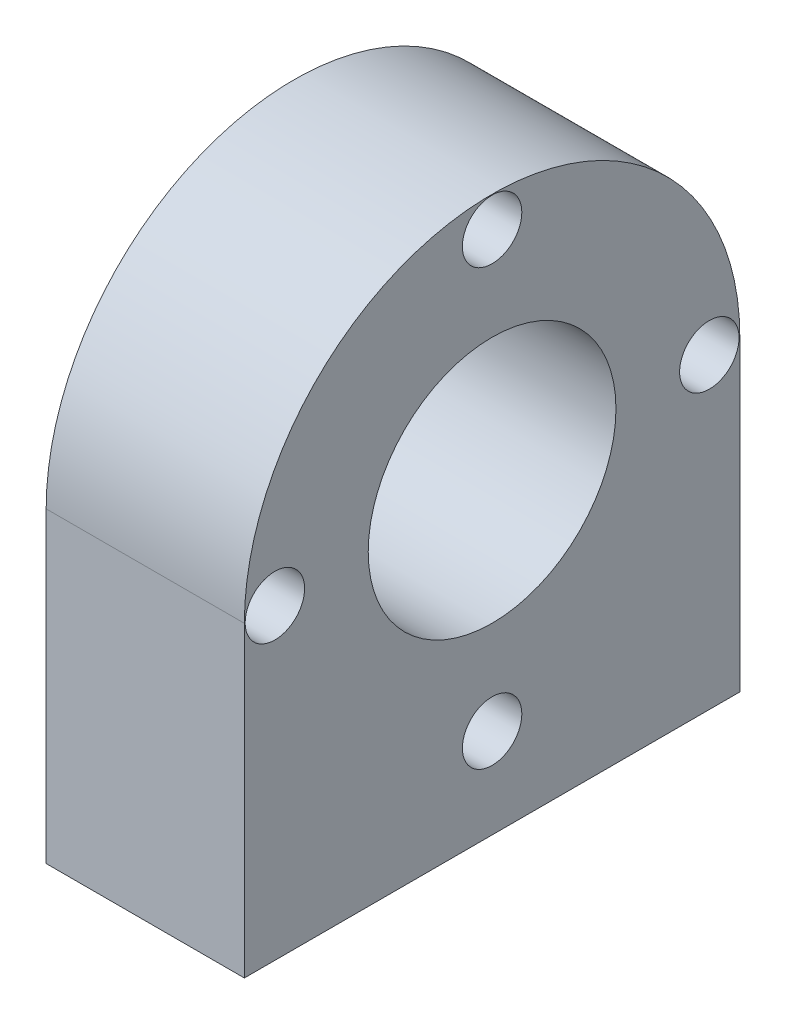
ISO-10303-21;
HEADER;
FILE_DESCRIPTION(('STEP AP214'),'2;1');
FILE_NAME('part.step','',(''),(''),'','','');
FILE_SCHEMA(('AUTOMOTIVE_DESIGN { 1 0 10303 214 1 1 1 1 }'));
ENDSEC;
DATA;
#1=APPLICATION_CONTEXT('core data for automotive mechanical design processes');
#2=APPLICATION_PROTOCOL_DEFINITION('international standard','automotive_design',2000,#1);
#3=PRODUCT_CONTEXT('',#1,'mechanical');
#4=PRODUCT('Part','Part','',(#3));
#5=PRODUCT_RELATED_PRODUCT_CATEGORY('part','',(#4));
#6=PRODUCT_DEFINITION_FORMATION('','',#4);
#7=PRODUCT_DEFINITION_CONTEXT('part definition',#1,'design');
#8=PRODUCT_DEFINITION('design','',#6,#7);
#9=PRODUCT_DEFINITION_SHAPE('','',#8);
#10=(LENGTH_UNIT() NAMED_UNIT(*) SI_UNIT(.MILLI.,.METRE.));
#11=(NAMED_UNIT(*) PLANE_ANGLE_UNIT() SI_UNIT($,.RADIAN.));
#12=(NAMED_UNIT(*) SI_UNIT($,.STERADIAN.) SOLID_ANGLE_UNIT());
#13=UNCERTAINTY_MEASURE_WITH_UNIT(LENGTH_MEASURE(1.E-05),#10,'distance_accuracy_value','');
#14=(GEOMETRIC_REPRESENTATION_CONTEXT(3) GLOBAL_UNCERTAINTY_ASSIGNED_CONTEXT((#13)) GLOBAL_UNIT_ASSIGNED_CONTEXT((#10,
#11,#12)) REPRESENTATION_CONTEXT('',''));
#15=CARTESIAN_POINT('',(0.,0.,0.));
#16=DIRECTION('',(0.,0.,1.));
#17=DIRECTION('',(1.,0.,0.));
#18=AXIS2_PLACEMENT_3D('',#15,#16,#17);
#19=CARTESIAN_POINT('',(10.,9.07968978321703,-2.28983498828939E-13));
#20=DIRECTION('',(-1.,0.,0.));
#21=DIRECTION('',(0.,0.,1.));
#22=AXIS2_PLACEMENT_3D('',#19,#20,#21);
#23=CYLINDRICAL_SURFACE('',#22,1.5);
#24=CARTESIAN_POINT('',(-10.,9.07968978321703,-2.28983498828939E-13));
#25=DIRECTION('',(-1.,0.,0.));
#26=DIRECTION('',(0.,0.,1.));
#27=AXIS2_PLACEMENT_3D('',#24,#25,#26);
#28=CIRCLE('',#27,1.5);
#29=CARTESIAN_POINT('',(-10.,9.07968978321703,1.49999999999977));
#30=VERTEX_POINT('',#29);
#31=EDGE_CURVE('E153',#30,#30,#28,.T.);
#32=CARTESIAN_POINT('',(-2.,9.07968978321703,-2.28983498828939E-13));
#33=DIRECTION('',(1.,0.,0.));
#34=DIRECTION('',(0.,0.,-1.));
#35=AXIS2_PLACEMENT_3D('',#32,#33,#34);
#36=CIRCLE('',#35,1.5);
#37=CARTESIAN_POINT('',(-2.,9.07968978321703,1.49999999999977));
#38=VERTEX_POINT('',#37);
#39=EDGE_CURVE('E140',#38,#38,#36,.F.);
#40=CARTESIAN_POINT('',(-10.,9.07968978321703,1.49999999999977));
#41=CARTESIAN_POINT('',(-9.91666666666667,9.07968978321703,1.49999999999977));
#42=CARTESIAN_POINT('',(-9.83333333333333,9.07968978321703,1.49999999999977));
#43=CARTESIAN_POINT('',(-9.66666666666667,9.07968978321703,1.49999999999977));
#44=CARTESIAN_POINT('',(-9.58333333333333,9.07968978321703,1.49999999999977));
#45=CARTESIAN_POINT('',(-9.41666666666667,9.07968978321703,1.49999999999977));
#46=CARTESIAN_POINT('',(-9.33333333333333,9.07968978321703,1.49999999999977));
#47=CARTESIAN_POINT('',(-9.16666666666667,9.07968978321703,1.49999999999977));
#48=CARTESIAN_POINT('',(-9.08333333333333,9.07968978321703,1.49999999999977));
#49=CARTESIAN_POINT('',(-8.91666666666667,9.07968978321703,1.49999999999977));
#50=CARTESIAN_POINT('',(-8.83333333333333,9.07968978321703,1.49999999999977));
#51=CARTESIAN_POINT('',(-8.66666666666667,9.07968978321703,1.49999999999977));
#52=CARTESIAN_POINT('',(-8.58333333333333,9.07968978321703,1.49999999999977));
#53=CARTESIAN_POINT('',(-8.41666666666667,9.07968978321703,1.49999999999977));
#54=CARTESIAN_POINT('',(-8.33333333333333,9.07968978321703,1.49999999999977));
#55=CARTESIAN_POINT('',(-8.16666666666667,9.07968978321703,1.49999999999977));
#56=CARTESIAN_POINT('',(-8.08333333333333,9.07968978321703,1.49999999999977));
#57=CARTESIAN_POINT('',(-7.91666666666667,9.07968978321703,1.49999999999977));
#58=CARTESIAN_POINT('',(-7.83333333333333,9.07968978321703,1.49999999999977));
#59=CARTESIAN_POINT('',(-7.66666666666667,9.07968978321703,1.49999999999977));
#60=CARTESIAN_POINT('',(-7.58333333333333,9.07968978321703,1.49999999999977));
#61=CARTESIAN_POINT('',(-7.41666666666667,9.07968978321703,1.49999999999977));
#62=CARTESIAN_POINT('',(-7.33333333333334,9.07968978321703,1.49999999999977));
#63=CARTESIAN_POINT('',(-7.16666666666667,9.07968978321703,1.49999999999977));
#64=CARTESIAN_POINT('',(-7.08333333333334,9.07968978321703,1.49999999999977));
#65=CARTESIAN_POINT('',(-6.91666666666667,9.07968978321703,1.49999999999977));
#66=CARTESIAN_POINT('',(-6.83333333333334,9.07968978321703,1.49999999999977));
#67=CARTESIAN_POINT('',(-6.66666666666667,9.07968978321703,1.49999999999977));
#68=CARTESIAN_POINT('',(-6.58333333333334,9.07968978321703,1.49999999999977));
#69=CARTESIAN_POINT('',(-6.41666666666667,9.07968978321703,1.49999999999977));
#70=CARTESIAN_POINT('',(-6.33333333333334,9.07968978321703,1.49999999999977));
#71=CARTESIAN_POINT('',(-6.16666666666667,9.07968978321703,1.49999999999977));
#72=CARTESIAN_POINT('',(-6.08333333333334,9.07968978321703,1.49999999999977));
#73=CARTESIAN_POINT('',(-5.91666666666667,9.07968978321703,1.49999999999977));
#74=CARTESIAN_POINT('',(-5.83333333333334,9.07968978321703,1.49999999999977));
#75=CARTESIAN_POINT('',(-5.66666666666667,9.07968978321703,1.49999999999977));
#76=CARTESIAN_POINT('',(-5.58333333333334,9.07968978321703,1.49999999999977));
#77=CARTESIAN_POINT('',(-5.41666666666667,9.07968978321703,1.49999999999977));
#78=CARTESIAN_POINT('',(-5.33333333333334,9.07968978321703,1.49999999999977));
#79=CARTESIAN_POINT('',(-5.16666666666667,9.07968978321703,1.49999999999977));
#80=CARTESIAN_POINT('',(-5.08333333333334,9.07968978321703,1.49999999999977));
#81=CARTESIAN_POINT('',(-4.91666666666667,9.07968978321703,1.49999999999977));
#82=CARTESIAN_POINT('',(-4.83333333333334,9.07968978321703,1.49999999999977));
#83=CARTESIAN_POINT('',(-4.66666666666667,9.07968978321703,1.49999999999977));
#84=CARTESIAN_POINT('',(-4.58333333333334,9.07968978321703,1.49999999999977));
#85=CARTESIAN_POINT('',(-4.41666666666667,9.07968978321703,1.49999999999977));
#86=CARTESIAN_POINT('',(-4.33333333333334,9.07968978321703,1.49999999999977));
#87=CARTESIAN_POINT('',(-4.16666666666667,9.07968978321703,1.49999999999977));
#88=CARTESIAN_POINT('',(-4.08333333333334,9.07968978321703,1.49999999999977));
#89=CARTESIAN_POINT('',(-3.91666666666667,9.07968978321703,1.49999999999977));
#90=CARTESIAN_POINT('',(-3.83333333333334,9.07968978321703,1.49999999999977));
#91=CARTESIAN_POINT('',(-3.66666666666667,9.07968978321703,1.49999999999977));
#92=CARTESIAN_POINT('',(-3.58333333333334,9.07968978321703,1.49999999999977));
#93=CARTESIAN_POINT('',(-3.41666666666667,9.07968978321703,1.49999999999977));
#94=CARTESIAN_POINT('',(-3.33333333333334,9.07968978321703,1.49999999999977));
#95=CARTESIAN_POINT('',(-3.16666666666667,9.07968978321703,1.49999999999977));
#96=CARTESIAN_POINT('',(-3.08333333333334,9.07968978321703,1.49999999999977));
#97=CARTESIAN_POINT('',(-2.91666666666667,9.07968978321703,1.49999999999977));
#98=CARTESIAN_POINT('',(-2.83333333333334,9.07968978321703,1.49999999999977));
#99=CARTESIAN_POINT('',(-2.66666666666667,9.07968978321703,1.49999999999977));
#100=CARTESIAN_POINT('',(-2.58333333333334,9.07968978321703,1.49999999999977));
#101=CARTESIAN_POINT('',(-2.41666666666667,9.07968978321703,1.49999999999977));
#102=CARTESIAN_POINT('',(-2.33333333333334,9.07968978321703,1.49999999999977));
#103=CARTESIAN_POINT('',(-2.16666666666667,9.07968978321703,1.49999999999977));
#104=CARTESIAN_POINT('',(-2.08333333333334,9.07968978321703,1.49999999999977));
#105=CARTESIAN_POINT('',(-2.,9.07968978321703,1.49999999999977));
#106=B_SPLINE_CURVE_WITH_KNOTS('',3,(#40,#41,#42,#43,#44,#45,#46,#47,#48,#49,#50,#51,#52,#53,
#54,#55,#56,#57,#58,#59,#60,#61,#62,#63,#64,#65,#66,#67,#68,#69,#70,#71,#72,#73,#74,#75,#76,#77,
#78,#79,#80,#81,#82,#83,#84,#85,#86,#87,#88,#89,#90,#91,#92,#93,#94,#95,#96,#97,#98,#99,#100,
#101,#102,#103,#104,#105),.UNSPECIFIED.,.F.,.F.,(4,2,2,2,2,2,2,2,2,2,2,2,2,2,2,2,2,2,2,2,2,2,2,
2,2,2,2,2,2,2,2,2,4),(0.,0.25,0.5,0.750000000000001,1.,1.25,1.5,1.75,2.,2.25,2.5,2.75,3.,3.25,
3.5,3.75,4.,4.25,4.5,4.75,5.,5.25,5.5,5.75,6.,6.25,6.5,6.75,7.,7.25,7.5,7.75,8.),.UNSPECIFIED.);
#107=EDGE_CURVE('BSEAM65',#30,#38,#106,.T.);
#108=ORIENTED_EDGE('',*,*,#31,.T.);
#109=ORIENTED_EDGE('',*,*,#39,.F.);
#110=ORIENTED_EDGE('',*,*,#107,.T.);
#111=ORIENTED_EDGE('',*,*,#107,.F.);
#112=EDGE_LOOP('',(#108,#110,#109,#111));
#113=FACE_BOUND('',#112,.T.);
#114=ADVANCED_FACE('F65',(#113),#23,.F.);
#115=CARTESIAN_POINT('',(10.,30.9999999999998,21.920310216783));
#116=DIRECTION('',(-1.,0.,0.));
#117=DIRECTION('',(0.,0.,1.));
#118=AXIS2_PLACEMENT_3D('',#115,#116,#117);
#119=CYLINDRICAL_SURFACE('',#118,1.5);
#120=CARTESIAN_POINT('',(-10.,30.9999999999998,21.920310216783));
#121=DIRECTION('',(-1.,0.,0.));
#122=DIRECTION('',(0.,0.,1.));
#123=AXIS2_PLACEMENT_3D('',#120,#121,#122);
#124=CIRCLE('',#123,1.5);
#125=CARTESIAN_POINT('',(-10.,30.9999999999998,23.420310216783));
#126=VERTEX_POINT('',#125);
#127=EDGE_CURVE('E157',#126,#126,#124,.T.);
#128=CARTESIAN_POINT('',(-2.,30.9999999999998,21.920310216783));
#129=DIRECTION('',(1.,0.,0.));
#130=DIRECTION('',(0.,0.,-1.));
#131=AXIS2_PLACEMENT_3D('',#128,#129,#130);
#132=CIRCLE('',#131,1.5);
#133=CARTESIAN_POINT('',(-2.,30.9999999999998,23.420310216783));
#134=VERTEX_POINT('',#133);
#135=EDGE_CURVE('E137',#134,#134,#132,.F.);
#136=CARTESIAN_POINT('',(-10.,30.9999999999998,23.420310216783));
#137=CARTESIAN_POINT('',(-9.91666666666667,30.9999999999998,23.420310216783));
#138=CARTESIAN_POINT('',(-9.83333333333333,30.9999999999998,23.420310216783));
#139=CARTESIAN_POINT('',(-9.66666666666667,30.9999999999998,23.420310216783));
#140=CARTESIAN_POINT('',(-9.58333333333333,30.9999999999998,23.420310216783));
#141=CARTESIAN_POINT('',(-9.41666666666667,30.9999999999998,23.420310216783));
#142=CARTESIAN_POINT('',(-9.33333333333333,30.9999999999998,23.420310216783));
#143=CARTESIAN_POINT('',(-9.16666666666667,30.9999999999998,23.420310216783));
#144=CARTESIAN_POINT('',(-9.08333333333333,30.9999999999998,23.420310216783));
#145=CARTESIAN_POINT('',(-8.91666666666667,30.9999999999998,23.420310216783));
#146=CARTESIAN_POINT('',(-8.83333333333333,30.9999999999998,23.420310216783));
#147=CARTESIAN_POINT('',(-8.66666666666667,30.9999999999998,23.420310216783));
#148=CARTESIAN_POINT('',(-8.58333333333333,30.9999999999998,23.420310216783));
#149=CARTESIAN_POINT('',(-8.41666666666667,30.9999999999998,23.420310216783));
#150=CARTESIAN_POINT('',(-8.33333333333333,30.9999999999998,23.420310216783));
#151=CARTESIAN_POINT('',(-8.16666666666667,30.9999999999998,23.420310216783));
#152=CARTESIAN_POINT('',(-8.08333333333333,30.9999999999998,23.420310216783));
#153=CARTESIAN_POINT('',(-7.91666666666667,30.9999999999998,23.420310216783));
#154=CARTESIAN_POINT('',(-7.83333333333333,30.9999999999998,23.420310216783));
#155=CARTESIAN_POINT('',(-7.66666666666667,30.9999999999998,23.420310216783));
#156=CARTESIAN_POINT('',(-7.58333333333333,30.9999999999998,23.420310216783));
#157=CARTESIAN_POINT('',(-7.41666666666667,30.9999999999998,23.420310216783));
#158=CARTESIAN_POINT('',(-7.33333333333334,30.9999999999998,23.420310216783));
#159=CARTESIAN_POINT('',(-7.16666666666667,30.9999999999998,23.420310216783));
#160=CARTESIAN_POINT('',(-7.08333333333334,30.9999999999998,23.420310216783));
#161=CARTESIAN_POINT('',(-6.91666666666667,30.9999999999998,23.420310216783));
#162=CARTESIAN_POINT('',(-6.83333333333334,30.9999999999998,23.420310216783));
#163=CARTESIAN_POINT('',(-6.66666666666667,30.9999999999998,23.420310216783));
#164=CARTESIAN_POINT('',(-6.58333333333334,30.9999999999998,23.420310216783));
#165=CARTESIAN_POINT('',(-6.41666666666667,30.9999999999998,23.420310216783));
#166=CARTESIAN_POINT('',(-6.33333333333334,30.9999999999998,23.420310216783));
#167=CARTESIAN_POINT('',(-6.16666666666667,30.9999999999998,23.420310216783));
#168=CARTESIAN_POINT('',(-6.08333333333334,30.9999999999998,23.420310216783));
#169=CARTESIAN_POINT('',(-5.91666666666667,30.9999999999998,23.420310216783));
#170=CARTESIAN_POINT('',(-5.83333333333334,30.9999999999998,23.420310216783));
#171=CARTESIAN_POINT('',(-5.66666666666667,30.9999999999998,23.420310216783));
#172=CARTESIAN_POINT('',(-5.58333333333334,30.9999999999998,23.420310216783));
#173=CARTESIAN_POINT('',(-5.41666666666667,30.9999999999998,23.420310216783));
#174=CARTESIAN_POINT('',(-5.33333333333334,30.9999999999998,23.420310216783));
#175=CARTESIAN_POINT('',(-5.16666666666667,30.9999999999998,23.420310216783));
#176=CARTESIAN_POINT('',(-5.08333333333334,30.9999999999998,23.420310216783));
#177=CARTESIAN_POINT('',(-4.91666666666667,30.9999999999998,23.420310216783));
#178=CARTESIAN_POINT('',(-4.83333333333334,30.9999999999998,23.420310216783));
#179=CARTESIAN_POINT('',(-4.66666666666667,30.9999999999998,23.420310216783));
#180=CARTESIAN_POINT('',(-4.58333333333334,30.9999999999998,23.420310216783));
#181=CARTESIAN_POINT('',(-4.41666666666667,30.9999999999998,23.420310216783));
#182=CARTESIAN_POINT('',(-4.33333333333334,30.9999999999998,23.420310216783));
#183=CARTESIAN_POINT('',(-4.16666666666667,30.9999999999998,23.420310216783));
#184=CARTESIAN_POINT('',(-4.08333333333334,30.9999999999998,23.420310216783));
#185=CARTESIAN_POINT('',(-3.91666666666667,30.9999999999998,23.420310216783));
#186=CARTESIAN_POINT('',(-3.83333333333334,30.9999999999998,23.420310216783));
#187=CARTESIAN_POINT('',(-3.66666666666667,30.9999999999998,23.420310216783));
#188=CARTESIAN_POINT('',(-3.58333333333334,30.9999999999998,23.420310216783));
#189=CARTESIAN_POINT('',(-3.41666666666667,30.9999999999998,23.420310216783));
#190=CARTESIAN_POINT('',(-3.33333333333334,30.9999999999998,23.420310216783));
#191=CARTESIAN_POINT('',(-3.16666666666667,30.9999999999998,23.420310216783));
#192=CARTESIAN_POINT('',(-3.08333333333334,30.9999999999998,23.420310216783));
#193=CARTESIAN_POINT('',(-2.91666666666667,30.9999999999998,23.420310216783));
#194=CARTESIAN_POINT('',(-2.83333333333334,30.9999999999998,23.420310216783));
#195=CARTESIAN_POINT('',(-2.66666666666667,30.9999999999998,23.420310216783));
#196=CARTESIAN_POINT('',(-2.58333333333334,30.9999999999998,23.420310216783));
#197=CARTESIAN_POINT('',(-2.41666666666667,30.9999999999998,23.420310216783));
#198=CARTESIAN_POINT('',(-2.33333333333334,30.9999999999998,23.420310216783));
#199=CARTESIAN_POINT('',(-2.16666666666667,30.9999999999998,23.420310216783));
#200=CARTESIAN_POINT('',(-2.08333333333334,30.9999999999998,23.420310216783));
#201=CARTESIAN_POINT('',(-2.,30.9999999999998,23.420310216783));
#202=B_SPLINE_CURVE_WITH_KNOTS('',3,(#136,#137,#138,#139,#140,#141,#142,#143,#144,#145,#146,
#147,#148,#149,#150,#151,#152,#153,#154,#155,#156,#157,#158,#159,#160,#161,#162,#163,#164,#165,
#166,#167,#168,#169,#170,#171,#172,#173,#174,#175,#176,#177,#178,#179,#180,#181,#182,#183,#184,
#185,#186,#187,#188,#189,#190,#191,#192,#193,#194,#195,#196,#197,#198,#199,#200,#201),
.UNSPECIFIED.,.F.,.F.,(4,2,2,2,2,2,2,2,2,2,2,2,2,2,2,2,2,2,2,2,2,2,2,2,2,2,2,2,2,2,2,2,4),(0.,
0.25,0.5,0.750000000000001,1.,1.25,1.5,1.75,2.,2.25,2.5,2.75,3.,3.25,3.5,3.75,4.,4.25,4.5,4.75,
5.,5.25,5.5,5.75,6.,6.25,6.5,6.75,7.,7.25,7.5,7.75,8.),.UNSPECIFIED.);
#203=EDGE_CURVE('BSEAM221',#126,#134,#202,.T.);
#204=ORIENTED_EDGE('',*,*,#127,.T.);
#205=ORIENTED_EDGE('',*,*,#135,.F.);
#206=ORIENTED_EDGE('',*,*,#203,.T.);
#207=ORIENTED_EDGE('',*,*,#203,.F.);
#208=EDGE_LOOP('',(#204,#206,#205,#207));
#209=FACE_BOUND('',#208,.T.);
#210=ADVANCED_FACE('F221',(#209),#119,.F.);
#211=CARTESIAN_POINT('',(10.,52.920310216783,0.));
#212=DIRECTION('',(-1.,0.,0.));
#213=DIRECTION('',(0.,0.,1.));
#214=AXIS2_PLACEMENT_3D('',#211,#212,#213);
#215=CYLINDRICAL_SURFACE('',#214,1.50000000000001);
#216=CARTESIAN_POINT('',(-10.,52.920310216783,0.));
#217=DIRECTION('',(-1.,0.,0.));
#218=DIRECTION('',(0.,0.,1.));
#219=AXIS2_PLACEMENT_3D('',#216,#217,#218);
#220=CIRCLE('',#219,1.50000000000001);
#221=CARTESIAN_POINT('',(-10.,52.920310216783,1.50000000000009));
#222=VERTEX_POINT('',#221);
#223=EDGE_CURVE('E162',#222,#222,#220,.T.);
#224=CARTESIAN_POINT('',(-2.,52.920310216783,0.));
#225=DIRECTION('',(1.,0.,0.));
#226=DIRECTION('',(0.,0.,-1.));
#227=AXIS2_PLACEMENT_3D('',#224,#225,#226);
#228=CIRCLE('',#227,1.50000000000001);
#229=CARTESIAN_POINT('',(-2.,52.920310216783,1.50000000000009));
#230=VERTEX_POINT('',#229);
#231=EDGE_CURVE('E133',#230,#230,#228,.F.);
#232=CARTESIAN_POINT('',(-10.,52.920310216783,1.50000000000009));
#233=CARTESIAN_POINT('',(-9.91666666666667,52.920310216783,1.50000000000009));
#234=CARTESIAN_POINT('',(-9.83333333333333,52.920310216783,1.50000000000009));
#235=CARTESIAN_POINT('',(-9.66666666666667,52.920310216783,1.50000000000009));
#236=CARTESIAN_POINT('',(-9.58333333333333,52.920310216783,1.50000000000009));
#237=CARTESIAN_POINT('',(-9.41666666666667,52.920310216783,1.50000000000009));
#238=CARTESIAN_POINT('',(-9.33333333333333,52.920310216783,1.50000000000009));
#239=CARTESIAN_POINT('',(-9.16666666666667,52.920310216783,1.50000000000009));
#240=CARTESIAN_POINT('',(-9.08333333333333,52.920310216783,1.50000000000009));
#241=CARTESIAN_POINT('',(-8.91666666666667,52.920310216783,1.50000000000009));
#242=CARTESIAN_POINT('',(-8.83333333333333,52.920310216783,1.50000000000009));
#243=CARTESIAN_POINT('',(-8.66666666666667,52.920310216783,1.50000000000009));
#244=CARTESIAN_POINT('',(-8.58333333333333,52.920310216783,1.50000000000009));
#245=CARTESIAN_POINT('',(-8.41666666666667,52.920310216783,1.50000000000009));
#246=CARTESIAN_POINT('',(-8.33333333333333,52.920310216783,1.50000000000009));
#247=CARTESIAN_POINT('',(-8.16666666666667,52.920310216783,1.50000000000009));
#248=CARTESIAN_POINT('',(-8.08333333333333,52.920310216783,1.50000000000009));
#249=CARTESIAN_POINT('',(-7.91666666666667,52.920310216783,1.50000000000009));
#250=CARTESIAN_POINT('',(-7.83333333333333,52.920310216783,1.50000000000009));
#251=CARTESIAN_POINT('',(-7.66666666666667,52.920310216783,1.50000000000009));
#252=CARTESIAN_POINT('',(-7.58333333333333,52.920310216783,1.50000000000009));
#253=CARTESIAN_POINT('',(-7.41666666666667,52.920310216783,1.50000000000009));
#254=CARTESIAN_POINT('',(-7.33333333333334,52.920310216783,1.50000000000009));
#255=CARTESIAN_POINT('',(-7.16666666666667,52.920310216783,1.50000000000009));
#256=CARTESIAN_POINT('',(-7.08333333333334,52.920310216783,1.50000000000009));
#257=CARTESIAN_POINT('',(-6.91666666666667,52.920310216783,1.50000000000009));
#258=CARTESIAN_POINT('',(-6.83333333333334,52.920310216783,1.50000000000009));
#259=CARTESIAN_POINT('',(-6.66666666666667,52.920310216783,1.50000000000009));
#260=CARTESIAN_POINT('',(-6.58333333333334,52.920310216783,1.50000000000009));
#261=CARTESIAN_POINT('',(-6.41666666666667,52.920310216783,1.50000000000009));
#262=CARTESIAN_POINT('',(-6.33333333333334,52.920310216783,1.50000000000009));
#263=CARTESIAN_POINT('',(-6.16666666666667,52.920310216783,1.50000000000009));
#264=CARTESIAN_POINT('',(-6.08333333333334,52.920310216783,1.50000000000009));
#265=CARTESIAN_POINT('',(-5.91666666666667,52.920310216783,1.50000000000009));
#266=CARTESIAN_POINT('',(-5.83333333333334,52.920310216783,1.50000000000009));
#267=CARTESIAN_POINT('',(-5.66666666666667,52.920310216783,1.50000000000009));
#268=CARTESIAN_POINT('',(-5.58333333333334,52.920310216783,1.50000000000009));
#269=CARTESIAN_POINT('',(-5.41666666666667,52.920310216783,1.50000000000009));
#270=CARTESIAN_POINT('',(-5.33333333333334,52.920310216783,1.50000000000009));
#271=CARTESIAN_POINT('',(-5.16666666666667,52.920310216783,1.50000000000009));
#272=CARTESIAN_POINT('',(-5.08333333333334,52.920310216783,1.50000000000009));
#273=CARTESIAN_POINT('',(-4.91666666666667,52.920310216783,1.50000000000009));
#274=CARTESIAN_POINT('',(-4.83333333333334,52.920310216783,1.50000000000009));
#275=CARTESIAN_POINT('',(-4.66666666666667,52.920310216783,1.50000000000009));
#276=CARTESIAN_POINT('',(-4.58333333333334,52.920310216783,1.50000000000009));
#277=CARTESIAN_POINT('',(-4.41666666666667,52.920310216783,1.50000000000009));
#278=CARTESIAN_POINT('',(-4.33333333333334,52.920310216783,1.50000000000009));
#279=CARTESIAN_POINT('',(-4.16666666666667,52.920310216783,1.50000000000009));
#280=CARTESIAN_POINT('',(-4.08333333333334,52.920310216783,1.50000000000009));
#281=CARTESIAN_POINT('',(-3.91666666666667,52.920310216783,1.50000000000009));
#282=CARTESIAN_POINT('',(-3.83333333333334,52.920310216783,1.50000000000009));
#283=CARTESIAN_POINT('',(-3.66666666666667,52.920310216783,1.50000000000009));
#284=CARTESIAN_POINT('',(-3.58333333333334,52.920310216783,1.50000000000009));
#285=CARTESIAN_POINT('',(-3.41666666666667,52.920310216783,1.50000000000009));
#286=CARTESIAN_POINT('',(-3.33333333333334,52.920310216783,1.50000000000009));
#287=CARTESIAN_POINT('',(-3.16666666666667,52.920310216783,1.50000000000009));
#288=CARTESIAN_POINT('',(-3.08333333333334,52.920310216783,1.50000000000009));
#289=CARTESIAN_POINT('',(-2.91666666666667,52.920310216783,1.50000000000009));
#290=CARTESIAN_POINT('',(-2.83333333333334,52.920310216783,1.50000000000009));
#291=CARTESIAN_POINT('',(-2.66666666666667,52.920310216783,1.50000000000009));
#292=CARTESIAN_POINT('',(-2.58333333333334,52.920310216783,1.50000000000009));
#293=CARTESIAN_POINT('',(-2.41666666666667,52.920310216783,1.50000000000009));
#294=CARTESIAN_POINT('',(-2.33333333333334,52.920310216783,1.50000000000009));
#295=CARTESIAN_POINT('',(-2.16666666666667,52.920310216783,1.50000000000009));
#296=CARTESIAN_POINT('',(-2.08333333333334,52.920310216783,1.50000000000009));
#297=CARTESIAN_POINT('',(-2.,52.920310216783,1.50000000000009));
#298=B_SPLINE_CURVE_WITH_KNOTS('',3,(#232,#233,#234,#235,#236,#237,#238,#239,#240,#241,#242,
#243,#244,#245,#246,#247,#248,#249,#250,#251,#252,#253,#254,#255,#256,#257,#258,#259,#260,#261,
#262,#263,#264,#265,#266,#267,#268,#269,#270,#271,#272,#273,#274,#275,#276,#277,#278,#279,#280,
#281,#282,#283,#284,#285,#286,#287,#288,#289,#290,#291,#292,#293,#294,#295,#296,#297),
.UNSPECIFIED.,.F.,.F.,(4,2,2,2,2,2,2,2,2,2,2,2,2,2,2,2,2,2,2,2,2,2,2,2,2,2,2,2,2,2,2,2,4),(0.,
0.25,0.5,0.750000000000001,1.,1.25,1.5,1.75,2.,2.25,2.5,2.75,3.,3.25,3.5,3.75,4.,4.25,4.5,4.75,
5.,5.25,5.5,5.75,6.,6.25,6.5,6.75,7.,7.25,7.5,7.75,8.),.UNSPECIFIED.);
#299=EDGE_CURVE('BSEAM226',#222,#230,#298,.T.);
#300=ORIENTED_EDGE('',*,*,#223,.T.);
#301=ORIENTED_EDGE('',*,*,#231,.F.);
#302=ORIENTED_EDGE('',*,*,#299,.T.);
#303=ORIENTED_EDGE('',*,*,#299,.F.);
#304=EDGE_LOOP('',(#300,#302,#301,#303));
#305=FACE_BOUND('',#304,.T.);
#306=ADVANCED_FACE('F226',(#305),#215,.F.);
#307=CARTESIAN_POINT('',(10.,31.,-21.920310216783));
#308=DIRECTION('',(-1.,0.,0.));
#309=DIRECTION('',(0.,0.,1.));
#310=AXIS2_PLACEMENT_3D('',#307,#308,#309);
#311=CYLINDRICAL_SURFACE('',#310,1.5);
#312=CARTESIAN_POINT('',(-10.,31.,-21.920310216783));
#313=DIRECTION('',(-1.,0.,0.));
#314=DIRECTION('',(0.,0.,1.));
#315=AXIS2_PLACEMENT_3D('',#312,#313,#314);
#316=CIRCLE('',#315,1.5);
#317=CARTESIAN_POINT('',(-10.,31.,-20.420310216783));
#318=VERTEX_POINT('',#317);
#319=EDGE_CURVE('E191',#318,#318,#316,.T.);
#320=CARTESIAN_POINT('',(-2.,31.,-21.920310216783));
#321=DIRECTION('',(1.,0.,0.));
#322=DIRECTION('',(0.,0.,-1.));
#323=AXIS2_PLACEMENT_3D('',#320,#321,#322);
#324=CIRCLE('',#323,1.5);
#325=CARTESIAN_POINT('',(-2.,31.,-20.420310216783));
#326=VERTEX_POINT('',#325);
#327=EDGE_CURVE('E130',#326,#326,#324,.F.);
#328=CARTESIAN_POINT('',(-10.,31.,-20.420310216783));
#329=CARTESIAN_POINT('',(-9.91666666666667,31.,-20.420310216783));
#330=CARTESIAN_POINT('',(-9.83333333333333,31.,-20.420310216783));
#331=CARTESIAN_POINT('',(-9.66666666666667,31.,-20.420310216783));
#332=CARTESIAN_POINT('',(-9.58333333333333,31.,-20.420310216783));
#333=CARTESIAN_POINT('',(-9.41666666666667,31.,-20.420310216783));
#334=CARTESIAN_POINT('',(-9.33333333333333,31.,-20.420310216783));
#335=CARTESIAN_POINT('',(-9.16666666666667,31.,-20.420310216783));
#336=CARTESIAN_POINT('',(-9.08333333333333,31.,-20.420310216783));
#337=CARTESIAN_POINT('',(-8.91666666666667,31.,-20.420310216783));
#338=CARTESIAN_POINT('',(-8.83333333333333,31.,-20.420310216783));
#339=CARTESIAN_POINT('',(-8.66666666666667,31.,-20.420310216783));
#340=CARTESIAN_POINT('',(-8.58333333333333,31.,-20.420310216783));
#341=CARTESIAN_POINT('',(-8.41666666666667,31.,-20.420310216783));
#342=CARTESIAN_POINT('',(-8.33333333333333,31.,-20.420310216783));
#343=CARTESIAN_POINT('',(-8.16666666666667,31.,-20.420310216783));
#344=CARTESIAN_POINT('',(-8.08333333333333,31.,-20.420310216783));
#345=CARTESIAN_POINT('',(-7.91666666666667,31.,-20.420310216783));
#346=CARTESIAN_POINT('',(-7.83333333333333,31.,-20.420310216783));
#347=CARTESIAN_POINT('',(-7.66666666666667,31.,-20.420310216783));
#348=CARTESIAN_POINT('',(-7.58333333333333,31.,-20.420310216783));
#349=CARTESIAN_POINT('',(-7.41666666666667,31.,-20.420310216783));
#350=CARTESIAN_POINT('',(-7.33333333333334,31.,-20.420310216783));
#351=CARTESIAN_POINT('',(-7.16666666666667,31.,-20.420310216783));
#352=CARTESIAN_POINT('',(-7.08333333333334,31.,-20.420310216783));
#353=CARTESIAN_POINT('',(-6.91666666666667,31.,-20.420310216783));
#354=CARTESIAN_POINT('',(-6.83333333333334,31.,-20.420310216783));
#355=CARTESIAN_POINT('',(-6.66666666666667,31.,-20.420310216783));
#356=CARTESIAN_POINT('',(-6.58333333333334,31.,-20.420310216783));
#357=CARTESIAN_POINT('',(-6.41666666666667,31.,-20.420310216783));
#358=CARTESIAN_POINT('',(-6.33333333333334,31.,-20.420310216783));
#359=CARTESIAN_POINT('',(-6.16666666666667,31.,-20.420310216783));
#360=CARTESIAN_POINT('',(-6.08333333333334,31.,-20.420310216783));
#361=CARTESIAN_POINT('',(-5.91666666666667,31.,-20.420310216783));
#362=CARTESIAN_POINT('',(-5.83333333333334,31.,-20.420310216783));
#363=CARTESIAN_POINT('',(-5.66666666666667,31.,-20.420310216783));
#364=CARTESIAN_POINT('',(-5.58333333333334,31.,-20.420310216783));
#365=CARTESIAN_POINT('',(-5.41666666666667,31.,-20.420310216783));
#366=CARTESIAN_POINT('',(-5.33333333333334,31.,-20.420310216783));
#367=CARTESIAN_POINT('',(-5.16666666666667,31.,-20.420310216783));
#368=CARTESIAN_POINT('',(-5.08333333333334,31.,-20.420310216783));
#369=CARTESIAN_POINT('',(-4.91666666666667,31.,-20.420310216783));
#370=CARTESIAN_POINT('',(-4.83333333333334,31.,-20.420310216783));
#371=CARTESIAN_POINT('',(-4.66666666666667,31.,-20.420310216783));
#372=CARTESIAN_POINT('',(-4.58333333333334,31.,-20.420310216783));
#373=CARTESIAN_POINT('',(-4.41666666666667,31.,-20.420310216783));
#374=CARTESIAN_POINT('',(-4.33333333333334,31.,-20.420310216783));
#375=CARTESIAN_POINT('',(-4.16666666666667,31.,-20.420310216783));
#376=CARTESIAN_POINT('',(-4.08333333333334,31.,-20.420310216783));
#377=CARTESIAN_POINT('',(-3.91666666666667,31.,-20.420310216783));
#378=CARTESIAN_POINT('',(-3.83333333333334,31.,-20.420310216783));
#379=CARTESIAN_POINT('',(-3.66666666666667,31.,-20.420310216783));
#380=CARTESIAN_POINT('',(-3.58333333333334,31.,-20.420310216783));
#381=CARTESIAN_POINT('',(-3.41666666666667,31.,-20.420310216783));
#382=CARTESIAN_POINT('',(-3.33333333333334,31.,-20.420310216783));
#383=CARTESIAN_POINT('',(-3.16666666666667,31.,-20.420310216783));
#384=CARTESIAN_POINT('',(-3.08333333333334,31.,-20.420310216783));
#385=CARTESIAN_POINT('',(-2.91666666666667,31.,-20.420310216783));
#386=CARTESIAN_POINT('',(-2.83333333333334,31.,-20.420310216783));
#387=CARTESIAN_POINT('',(-2.66666666666667,31.,-20.420310216783));
#388=CARTESIAN_POINT('',(-2.58333333333334,31.,-20.420310216783));
#389=CARTESIAN_POINT('',(-2.41666666666667,31.,-20.420310216783));
#390=CARTESIAN_POINT('',(-2.33333333333334,31.,-20.420310216783));
#391=CARTESIAN_POINT('',(-2.16666666666667,31.,-20.420310216783));
#392=CARTESIAN_POINT('',(-2.08333333333334,31.,-20.420310216783));
#393=CARTESIAN_POINT('',(-2.,31.,-20.420310216783));
#394=B_SPLINE_CURVE_WITH_KNOTS('',3,(#328,#329,#330,#331,#332,#333,#334,#335,#336,#337,#338,
#339,#340,#341,#342,#343,#344,#345,#346,#347,#348,#349,#350,#351,#352,#353,#354,#355,#356,#357,
#358,#359,#360,#361,#362,#363,#364,#365,#366,#367,#368,#369,#370,#371,#372,#373,#374,#375,#376,
#377,#378,#379,#380,#381,#382,#383,#384,#385,#386,#387,#388,#389,#390,#391,#392,#393),
.UNSPECIFIED.,.F.,.F.,(4,2,2,2,2,2,2,2,2,2,2,2,2,2,2,2,2,2,2,2,2,2,2,2,2,2,2,2,2,2,2,2,4),(0.,
0.25,0.5,0.750000000000001,1.,1.25,1.5,1.75,2.,2.25,2.5,2.75,3.,3.25,3.5,3.75,4.,4.25,4.5,4.75,
5.,5.25,5.5,5.75,6.,6.25,6.5,6.75,7.,7.25,7.5,7.75,8.),.UNSPECIFIED.);
#395=EDGE_CURVE('BSEAM272',#318,#326,#394,.T.);
#396=ORIENTED_EDGE('',*,*,#319,.T.);
#397=ORIENTED_EDGE('',*,*,#327,.F.);
#398=ORIENTED_EDGE('',*,*,#395,.T.);
#399=ORIENTED_EDGE('',*,*,#395,.F.);
#400=EDGE_LOOP('',(#396,#398,#397,#399));
#401=FACE_BOUND('',#400,.T.);
#402=ADVANCED_FACE('F272',(#401),#311,.F.);
#403=CARTESIAN_POINT('',(0.,0.,0.));
#404=DIRECTION('',(0.,-1.,0.));
#405=DIRECTION('',(0.,0.,-1.));
#406=AXIS2_PLACEMENT_3D('',#403,#404,#405);
#407=PLANE('',#406);
#408=CARTESIAN_POINT('',(0.,0.,-9.));
#409=DIRECTION('',(0.,1.,0.));
#410=DIRECTION('',(0.,0.,1.));
#411=AXIS2_PLACEMENT_3D('',#408,#409,#410);
#412=CIRCLE('',#411,1.65);
#413=CARTESIAN_POINT('',(0.,0.,-7.35));
#414=VERTEX_POINT('',#413);
#415=EDGE_CURVE('E179',#414,#414,#412,.T.);
#416=ORIENTED_EDGE('',*,*,#415,.T.);
#417=EDGE_LOOP('',(#416));
#418=FACE_BOUND('',#417,.T.);
#419=CARTESIAN_POINT('',(0.,0.,-19.));
#420=DIRECTION('',(0.,1.,0.));
#421=DIRECTION('',(0.,0.,1.));
#422=AXIS2_PLACEMENT_3D('',#419,#420,#421);
#423=CIRCLE('',#422,1.65);
#424=CARTESIAN_POINT('',(0.,0.,-17.35));
#425=VERTEX_POINT('',#424);
#426=EDGE_CURVE('E185',#425,#425,#423,.T.);
#427=ORIENTED_EDGE('',*,*,#426,.T.);
#428=EDGE_LOOP('',(#427));
#429=FACE_BOUND('',#428,.T.);
#430=DIRECTION('',(0.,0.,-1.));
#431=VECTOR('',#430,1.);
#432=CARTESIAN_POINT('',(10.,0.,25.));
#433=LINE('',#432,#431);
#434=CARTESIAN_POINT('',(10.,0.,25.));
#435=VERTEX_POINT('',#434);
#436=CARTESIAN_POINT('',(10.,0.,-25.));
#437=VERTEX_POINT('',#436);
#438=EDGE_CURVE('E198',#435,#437,#433,.T.);
#439=ORIENTED_EDGE('',*,*,#438,.F.);
#440=DIRECTION('',(1.,0.,0.));
#441=VECTOR('',#440,1.);
#442=CARTESIAN_POINT('',(-10.,0.,25.));
#443=LINE('',#442,#441);
#444=CARTESIAN_POINT('',(-10.,0.,25.));
#445=VERTEX_POINT('',#444);
#446=EDGE_CURVE('E121',#445,#435,#443,.T.);
#447=ORIENTED_EDGE('',*,*,#446,.F.);
#448=DIRECTION('',(0.,0.,1.));
#449=VECTOR('',#448,1.);
#450=CARTESIAN_POINT('',(-10.,0.,25.));
#451=LINE('',#450,#449);
#452=CARTESIAN_POINT('',(-10.,0.,-25.));
#453=VERTEX_POINT('',#452);
#454=EDGE_CURVE('E125',#453,#445,#451,.T.);
#455=ORIENTED_EDGE('',*,*,#454,.F.);
#456=DIRECTION('',(-1.,0.,0.));
#457=VECTOR('',#456,1.);
#458=CARTESIAN_POINT('',(-10.,0.,-25.));
#459=LINE('',#458,#457);
#460=EDGE_CURVE('E200',#437,#453,#459,.T.);
#461=ORIENTED_EDGE('',*,*,#460,.F.);
#462=EDGE_LOOP('',(#439,#447,#455,#461));
#463=FACE_BOUND('',#462,.T.);
#464=CARTESIAN_POINT('',(0.,0.,9.));
#465=DIRECTION('',(0.,-1.,0.));
#466=DIRECTION('',(0.,0.,-1.));
#467=AXIS2_PLACEMENT_3D('',#464,#465,#466);
#468=CIRCLE('',#467,1.65);
#469=CARTESIAN_POINT('',(0.,0.,7.35));
#470=VERTEX_POINT('',#469);
#471=EDGE_CURVE('E173',#470,#470,#468,.T.);
#472=ORIENTED_EDGE('',*,*,#471,.F.);
#473=EDGE_LOOP('',(#472));
#474=FACE_BOUND('',#473,.T.);
#475=CARTESIAN_POINT('',(0.,0.,19.));
#476=DIRECTION('',(0.,-1.,0.));
#477=DIRECTION('',(0.,0.,-1.));
#478=AXIS2_PLACEMENT_3D('',#475,#476,#477);
#479=CIRCLE('',#478,1.65);
#480=CARTESIAN_POINT('',(0.,0.,17.35));
#481=VERTEX_POINT('',#480);
#482=EDGE_CURVE('E170',#481,#481,#479,.T.);
#483=ORIENTED_EDGE('',*,*,#482,.F.);
#484=EDGE_LOOP('',(#483));
#485=FACE_BOUND('',#484,.T.);
#486=ADVANCED_FACE('F208',(#418,#429,#463,#474,#485),#407,.T.);
#487=CARTESIAN_POINT('',(10.,56.,25.));
#488=DIRECTION('',(-1.,0.,0.));
#489=DIRECTION('',(0.,0.,1.));
#490=AXIS2_PLACEMENT_3D('',#487,#488,#489);
#491=PLANE('',#490);
#492=CARTESIAN_POINT('',(9.99999999999999,31.,-21.920310216783));
#493=DIRECTION('',(-1.,0.,0.));
#494=DIRECTION('',(0.,0.,1.));
#495=AXIS2_PLACEMENT_3D('',#492,#493,#494);
#496=CIRCLE('',#495,3.);
#497=CARTESIAN_POINT('',(9.99999999999999,31.,-18.920310216783));
#498=VERTEX_POINT('',#497);
#499=EDGE_CURVE('E69',#498,#498,#496,.T.);
#500=ORIENTED_EDGE('',*,*,#499,.T.);
#501=EDGE_LOOP('',(#500));
#502=FACE_BOUND('',#501,.T.);
#503=CARTESIAN_POINT('',(9.99999999999999,52.920310216783,-2.35922392732846E-13));
#504=DIRECTION('',(-1.,0.,0.));
#505=DIRECTION('',(0.,0.,1.));
#506=AXIS2_PLACEMENT_3D('',#503,#504,#505);
#507=CIRCLE('',#506,3.);
#508=CARTESIAN_POINT('',(9.99999999999999,52.920310216783,2.99999999999977));
#509=VERTEX_POINT('',#508);
#510=EDGE_CURVE('E148',#509,#509,#507,.T.);
#511=ORIENTED_EDGE('',*,*,#510,.T.);
#512=EDGE_LOOP('',(#511));
#513=FACE_BOUND('',#512,.T.);
#514=CARTESIAN_POINT('',(9.99999999999999,31.0000000000002,21.920310216783));
#515=DIRECTION('',(-1.,0.,0.));
#516=DIRECTION('',(0.,0.,1.));
#517=AXIS2_PLACEMENT_3D('',#514,#515,#516);
#518=CIRCLE('',#517,3.);
#519=CARTESIAN_POINT('',(9.99999999999999,31.0000000000002,24.920310216783));
#520=VERTEX_POINT('',#519);
#521=EDGE_CURVE('E146',#520,#520,#518,.T.);
#522=ORIENTED_EDGE('',*,*,#521,.T.);
#523=EDGE_LOOP('',(#522));
#524=FACE_BOUND('',#523,.T.);
#525=CARTESIAN_POINT('',(9.99999999999999,9.07968978321703,0.));
#526=DIRECTION('',(-1.,0.,0.));
#527=DIRECTION('',(0.,0.,1.));
#528=AXIS2_PLACEMENT_3D('',#525,#526,#527);
#529=CIRCLE('',#528,3.);
#530=CARTESIAN_POINT('',(9.99999999999999,9.07968978321703,3.00000000000008));
#531=VERTEX_POINT('',#530);
#532=EDGE_CURVE('E143',#531,#531,#529,.T.);
#533=ORIENTED_EDGE('',*,*,#532,.T.);
#534=EDGE_LOOP('',(#533));
#535=FACE_BOUND('',#534,.T.);
#536=CARTESIAN_POINT('',(10.,31.,0.));
#537=DIRECTION('',(-1.,0.,0.));
#538=DIRECTION('',(0.,0.,1.));
#539=AXIS2_PLACEMENT_3D('',#536,#537,#538);
#540=CIRCLE('',#539,12.5);
#541=CARTESIAN_POINT('',(10.,31.,12.5));
#542=VERTEX_POINT('',#541);
#543=EDGE_CURVE('E117',#542,#542,#540,.T.);
#544=ORIENTED_EDGE('',*,*,#543,.T.);
#545=EDGE_LOOP('',(#544));
#546=FACE_BOUND('',#545,.T.);
#547=CARTESIAN_POINT('',(10.,31.,0.));
#548=DIRECTION('',(-1.,0.,0.));
#549=DIRECTION('',(0.,0.,1.));
#550=AXIS2_PLACEMENT_3D('',#547,#548,#549);
#551=CIRCLE('',#550,25.);
#552=CARTESIAN_POINT('',(10.,31.,25.));
#553=VERTEX_POINT('',#552);
#554=CARTESIAN_POINT('',(10.,31.,-25.));
#555=VERTEX_POINT('',#554);
#556=EDGE_CURVE('E107',#553,#555,#551,.T.);
#557=ORIENTED_EDGE('',*,*,#556,.F.);
#558=DIRECTION('',(0.,-1.,0.));
#559=VECTOR('',#558,1.);
#560=CARTESIAN_POINT('',(10.,56.,25.));
#561=LINE('',#560,#559);
#562=EDGE_CURVE('E82',#553,#435,#561,.T.);
#563=ORIENTED_EDGE('',*,*,#562,.T.);
#564=ORIENTED_EDGE('',*,*,#438,.T.);
#565=DIRECTION('',(0.,-1.,0.));
#566=VECTOR('',#565,1.);
#567=CARTESIAN_POINT('',(10.,56.,-25.));
#568=LINE('',#567,#566);
#569=EDGE_CURVE('E13',#555,#437,#568,.T.);
#570=ORIENTED_EDGE('',*,*,#569,.F.);
#571=EDGE_LOOP('',(#557,#563,#564,#570));
#572=FACE_BOUND('',#571,.T.);
#573=ADVANCED_FACE('F67',(#502,#513,#524,#535,#546,#572),#491,.F.);
#574=CARTESIAN_POINT('',(-10.,56.,25.));
#575=DIRECTION('',(1.,0.,0.));
#576=DIRECTION('',(0.,0.,-1.));
#577=AXIS2_PLACEMENT_3D('',#574,#575,#576);
#578=PLANE('',#577);
#579=ORIENTED_EDGE('',*,*,#319,.F.);
#580=EDGE_LOOP('',(#579));
#581=FACE_BOUND('',#580,.T.);
#582=ORIENTED_EDGE('',*,*,#223,.F.);
#583=EDGE_LOOP('',(#582));
#584=FACE_BOUND('',#583,.T.);
#585=ORIENTED_EDGE('',*,*,#127,.F.);
#586=EDGE_LOOP('',(#585));
#587=FACE_BOUND('',#586,.T.);
#588=ORIENTED_EDGE('',*,*,#31,.F.);
#589=EDGE_LOOP('',(#588));
#590=FACE_BOUND('',#589,.T.);
#591=CARTESIAN_POINT('',(-10.,31.,0.));
#592=DIRECTION('',(-1.,0.,0.));
#593=DIRECTION('',(0.,0.,1.));
#594=AXIS2_PLACEMENT_3D('',#591,#592,#593);
#595=CIRCLE('',#594,12.5);
#596=CARTESIAN_POINT('',(-10.,31.,12.5));
#597=VERTEX_POINT('',#596);
#598=EDGE_CURVE('E169',#597,#597,#595,.T.);
#599=ORIENTED_EDGE('',*,*,#598,.F.);
#600=EDGE_LOOP('',(#599));
#601=FACE_BOUND('',#600,.T.);
#602=DIRECTION('',(0.,-1.,0.));
#603=VECTOR('',#602,1.);
#604=CARTESIAN_POINT('',(-10.,56.,25.));
#605=LINE('',#604,#603);
#606=CARTESIAN_POINT('',(-10.,31.,25.));
#607=VERTEX_POINT('',#606);
#608=EDGE_CURVE('E89',#607,#445,#605,.T.);
#609=ORIENTED_EDGE('',*,*,#608,.F.);
#610=CARTESIAN_POINT('',(-10.,31.,0.));
#611=DIRECTION('',(-1.,0.,0.));
#612=DIRECTION('',(0.,0.,1.));
#613=AXIS2_PLACEMENT_3D('',#610,#611,#612);
#614=CIRCLE('',#613,25.);
#615=CARTESIAN_POINT('',(-10.,31.,-25.));
#616=VERTEX_POINT('',#615);
#617=EDGE_CURVE('E112',#607,#616,#614,.T.);
#618=ORIENTED_EDGE('',*,*,#617,.T.);
#619=DIRECTION('',(0.,-1.,0.));
#620=VECTOR('',#619,1.);
#621=CARTESIAN_POINT('',(-10.,56.,-25.));
#622=LINE('',#621,#620);
#623=EDGE_CURVE('E74',#616,#453,#622,.T.);
#624=ORIENTED_EDGE('',*,*,#623,.T.);
#625=ORIENTED_EDGE('',*,*,#454,.T.);
#626=EDGE_LOOP('',(#609,#618,#624,#625));
#627=FACE_BOUND('',#626,.T.);
#628=ADVANCED_FACE('F204',(#581,#584,#587,#590,#601,#627),#578,.F.);
#629=CARTESIAN_POINT('',(-10.,56.,-25.));
#630=DIRECTION('',(0.,0.,1.));
#631=DIRECTION('',(1.,0.,0.));
#632=AXIS2_PLACEMENT_3D('',#629,#630,#631);
#633=PLANE('',#632);
#634=DIRECTION('',(-1.,0.,0.));
#635=VECTOR('',#634,1.);
#636=CARTESIAN_POINT('',(10.,31.,-25.));
#637=LINE('',#636,#635);
#638=EDGE_CURVE('E111',#555,#616,#637,.T.);
#639=ORIENTED_EDGE('',*,*,#638,.F.);
#640=ORIENTED_EDGE('',*,*,#569,.T.);
#641=ORIENTED_EDGE('',*,*,#460,.T.);
#642=ORIENTED_EDGE('',*,*,#623,.F.);
#643=EDGE_LOOP('',(#639,#640,#641,#642));
#644=FACE_BOUND('',#643,.T.);
#645=ADVANCED_FACE('F211',(#644),#633,.F.);
#646=CARTESIAN_POINT('',(-10.,56.,25.));
#647=DIRECTION('',(0.,0.,-1.));
#648=DIRECTION('',(-1.,0.,0.));
#649=AXIS2_PLACEMENT_3D('',#646,#647,#648);
#650=PLANE('',#649);
#651=ORIENTED_EDGE('',*,*,#562,.F.);
#652=DIRECTION('',(-1.,0.,0.));
#653=VECTOR('',#652,1.);
#654=CARTESIAN_POINT('',(10.,31.,25.));
#655=LINE('',#654,#653);
#656=EDGE_CURVE('E114',#553,#607,#655,.T.);
#657=ORIENTED_EDGE('',*,*,#656,.T.);
#658=ORIENTED_EDGE('',*,*,#608,.T.);
#659=ORIENTED_EDGE('',*,*,#446,.T.);
#660=EDGE_LOOP('',(#651,#657,#658,#659));
#661=FACE_BOUND('',#660,.T.);
#662=ADVANCED_FACE('F119',(#661),#650,.F.);
#663=CARTESIAN_POINT('',(10.,31.,0.));
#664=DIRECTION('',(-1.,0.,0.));
#665=DIRECTION('',(0.,0.,1.));
#666=AXIS2_PLACEMENT_3D('',#663,#664,#665);
#667=CYLINDRICAL_SURFACE('',#666,25.);
#668=ORIENTED_EDGE('',*,*,#617,.F.);
#669=ORIENTED_EDGE('',*,*,#656,.F.);
#670=ORIENTED_EDGE('',*,*,#556,.T.);
#671=ORIENTED_EDGE('',*,*,#638,.T.);
#672=EDGE_LOOP('',(#668,#669,#670,#671));
#673=FACE_BOUND('',#672,.T.);
#674=ADVANCED_FACE('F115',(#673),#667,.T.);
#675=CARTESIAN_POINT('',(10.,31.,0.));
#676=DIRECTION('',(-1.,0.,0.));
#677=DIRECTION('',(0.,0.,1.));
#678=AXIS2_PLACEMENT_3D('',#675,#676,#677);
#679=CYLINDRICAL_SURFACE('',#678,12.5);
#680=ORIENTED_EDGE('',*,*,#543,.F.);
#681=EDGE_LOOP('',(#680));
#682=FACE_BOUND('',#681,.T.);
#683=ORIENTED_EDGE('',*,*,#598,.T.);
#684=EDGE_LOOP('',(#683));
#685=FACE_BOUND('',#684,.T.);
#686=ADVANCED_FACE('F261',(#682,#685),#679,.F.);
#687=CARTESIAN_POINT('',(0.,15.,-19.));
#688=DIRECTION('',(0.,-1.,0.));
#689=DIRECTION('',(0.,0.,-1.));
#690=AXIS2_PLACEMENT_3D('',#687,#688,#689);
#691=CYLINDRICAL_SURFACE('',#690,1.65);
#692=CARTESIAN_POINT('',(0.,15.,-19.));
#693=DIRECTION('',(0.,1.,0.));
#694=DIRECTION('',(0.,0.,1.));
#695=AXIS2_PLACEMENT_3D('',#692,#693,#694);
#696=CIRCLE('',#695,1.65);
#697=CARTESIAN_POINT('',(0.,15.,-17.35));
#698=VERTEX_POINT('',#697);
#699=EDGE_CURVE('E188',#698,#698,#696,.T.);
#700=ORIENTED_EDGE('',*,*,#699,.T.);
#701=EDGE_LOOP('',(#700));
#702=FACE_BOUND('',#701,.T.);
#703=ORIENTED_EDGE('',*,*,#426,.F.);
#704=EDGE_LOOP('',(#703));
#705=FACE_BOUND('',#704,.T.);
#706=ADVANCED_FACE('F258',(#702,#705),#691,.F.);
#707=CARTESIAN_POINT('',(0.,15.,-19.));
#708=DIRECTION('',(0.,1.,0.));
#709=DIRECTION('',(0.,0.,1.));
#710=AXIS2_PLACEMENT_3D('',#707,#708,#709);
#711=PLANE('',#710);
#712=ORIENTED_EDGE('',*,*,#699,.F.);
#713=EDGE_LOOP('',(#712));
#714=FACE_BOUND('',#713,.T.);
#715=ADVANCED_FACE('F253',(#714),#711,.F.);
#716=CARTESIAN_POINT('',(0.,15.,-9.));
#717=DIRECTION('',(0.,-1.,0.));
#718=DIRECTION('',(0.,0.,-1.));
#719=AXIS2_PLACEMENT_3D('',#716,#717,#718);
#720=CYLINDRICAL_SURFACE('',#719,1.65);
#721=CARTESIAN_POINT('',(0.,15.,-9.));
#722=DIRECTION('',(0.,1.,0.));
#723=DIRECTION('',(0.,0.,1.));
#724=AXIS2_PLACEMENT_3D('',#721,#722,#723);
#725=CIRCLE('',#724,1.65);
#726=CARTESIAN_POINT('',(0.,15.,-7.35));
#727=VERTEX_POINT('',#726);
#728=EDGE_CURVE('E182',#727,#727,#725,.T.);
#729=ORIENTED_EDGE('',*,*,#728,.T.);
#730=EDGE_LOOP('',(#729));
#731=FACE_BOUND('',#730,.T.);
#732=ORIENTED_EDGE('',*,*,#415,.F.);
#733=EDGE_LOOP('',(#732));
#734=FACE_BOUND('',#733,.T.);
#735=ADVANCED_FACE('F250',(#731,#734),#720,.F.);
#736=CARTESIAN_POINT('',(0.,15.,-9.));
#737=DIRECTION('',(0.,1.,0.));
#738=DIRECTION('',(0.,0.,1.));
#739=AXIS2_PLACEMENT_3D('',#736,#737,#738);
#740=PLANE('',#739);
#741=ORIENTED_EDGE('',*,*,#728,.F.);
#742=EDGE_LOOP('',(#741));
#743=FACE_BOUND('',#742,.T.);
#744=ADVANCED_FACE('F245',(#743),#740,.F.);
#745=CARTESIAN_POINT('',(0.,15.,9.));
#746=DIRECTION('',(0.,-1.,0.));
#747=DIRECTION('',(0.,0.,-1.));
#748=AXIS2_PLACEMENT_3D('',#745,#746,#747);
#749=CYLINDRICAL_SURFACE('',#748,1.65);
#750=CARTESIAN_POINT('',(0.,15.,9.));
#751=DIRECTION('',(0.,-1.,0.));
#752=DIRECTION('',(0.,0.,-1.));
#753=AXIS2_PLACEMENT_3D('',#750,#751,#752);
#754=CIRCLE('',#753,1.65);
#755=CARTESIAN_POINT('',(0.,15.,7.35));
#756=VERTEX_POINT('',#755);
#757=EDGE_CURVE('E176',#756,#756,#754,.T.);
#758=ORIENTED_EDGE('',*,*,#757,.F.);
#759=EDGE_LOOP('',(#758));
#760=FACE_BOUND('',#759,.T.);
#761=ORIENTED_EDGE('',*,*,#471,.T.);
#762=EDGE_LOOP('',(#761));
#763=FACE_BOUND('',#762,.T.);
#764=ADVANCED_FACE('F242',(#760,#763),#749,.F.);
#765=CARTESIAN_POINT('',(0.,15.,9.));
#766=DIRECTION('',(0.,-1.,0.));
#767=DIRECTION('',(0.,0.,-1.));
#768=AXIS2_PLACEMENT_3D('',#765,#766,#767);
#769=PLANE('',#768);
#770=ORIENTED_EDGE('',*,*,#757,.T.);
#771=EDGE_LOOP('',(#770));
#772=FACE_BOUND('',#771,.T.);
#773=ADVANCED_FACE('F240',(#772),#769,.T.);
#774=CARTESIAN_POINT('',(0.,15.,19.));
#775=DIRECTION('',(0.,-1.,0.));
#776=DIRECTION('',(0.,0.,-1.));
#777=AXIS2_PLACEMENT_3D('',#774,#775,#776);
#778=CYLINDRICAL_SURFACE('',#777,1.65);
#779=CARTESIAN_POINT('',(0.,15.,19.));
#780=DIRECTION('',(0.,-1.,0.));
#781=DIRECTION('',(0.,0.,-1.));
#782=AXIS2_PLACEMENT_3D('',#779,#780,#781);
#783=CIRCLE('',#782,1.65);
#784=CARTESIAN_POINT('',(0.,15.,17.35));
#785=VERTEX_POINT('',#784);
#786=EDGE_CURVE('E166',#785,#785,#783,.T.);
#787=ORIENTED_EDGE('',*,*,#786,.F.);
#788=EDGE_LOOP('',(#787));
#789=FACE_BOUND('',#788,.T.);
#790=ORIENTED_EDGE('',*,*,#482,.T.);
#791=EDGE_LOOP('',(#790));
#792=FACE_BOUND('',#791,.T.);
#793=ADVANCED_FACE('F236',(#789,#792),#778,.F.);
#794=CARTESIAN_POINT('',(0.,15.,19.));
#795=DIRECTION('',(0.,-1.,0.));
#796=DIRECTION('',(0.,0.,-1.));
#797=AXIS2_PLACEMENT_3D('',#794,#795,#796);
#798=PLANE('',#797);
#799=ORIENTED_EDGE('',*,*,#786,.T.);
#800=EDGE_LOOP('',(#799));
#801=FACE_BOUND('',#800,.T.);
#802=ADVANCED_FACE('F232',(#801),#798,.T.);
#803=CARTESIAN_POINT('',(-45.3553390593274,31.,-21.920310216783));
#804=DIRECTION('',(1.,0.,0.));
#805=DIRECTION('',(0.,0.,-1.));
#806=AXIS2_PLACEMENT_3D('',#803,#804,#805);
#807=CYLINDRICAL_SURFACE('',#806,3.);
#808=CARTESIAN_POINT('',(-2.,31.,-21.920310216783));
#809=DIRECTION('',(1.,0.,0.));
#810=DIRECTION('',(0.,0.,-1.));
#811=AXIS2_PLACEMENT_3D('',#808,#809,#810);
#812=CIRCLE('',#811,3.);
#813=CARTESIAN_POINT('',(-2.,31.,-24.920310216783));
#814=VERTEX_POINT('',#813);
#815=EDGE_CURVE('E134',#814,#814,#812,.F.);
#816=ORIENTED_EDGE('',*,*,#815,.T.);
#817=EDGE_LOOP('',(#816));
#818=FACE_BOUND('',#817,.T.);
#819=ORIENTED_EDGE('',*,*,#499,.F.);
#820=EDGE_LOOP('',(#819));
#821=FACE_BOUND('',#820,.T.);
#822=ADVANCED_FACE('F235',(#818,#821),#807,.F.);
#823=CARTESIAN_POINT('',(-2.,56.,25.));
#824=DIRECTION('',(1.,0.,0.));
#825=DIRECTION('',(0.,0.,-1.));
#826=AXIS2_PLACEMENT_3D('',#823,#824,#825);
#827=PLANE('',#826);
#828=ORIENTED_EDGE('',*,*,#815,.F.);
#829=EDGE_LOOP('',(#828));
#830=FACE_BOUND('',#829,.T.);
#831=ORIENTED_EDGE('',*,*,#327,.T.);
#832=EDGE_LOOP('',(#831));
#833=FACE_BOUND('',#832,.T.);
#834=ADVANCED_FACE('F309',(#830,#833),#827,.T.);
#835=CARTESIAN_POINT('',(-45.3553390593274,52.920310216783,-2.35922392732846E-13));
#836=DIRECTION('',(1.,0.,0.));
#837=DIRECTION('',(0.,0.,-1.));
#838=AXIS2_PLACEMENT_3D('',#835,#836,#837);
#839=CYLINDRICAL_SURFACE('',#838,3.);
#840=CARTESIAN_POINT('',(-2.,52.920310216783,-2.35922392732846E-13));
#841=DIRECTION('',(1.,0.,0.));
#842=DIRECTION('',(0.,0.,-1.));
#843=AXIS2_PLACEMENT_3D('',#840,#841,#842);
#844=CIRCLE('',#843,3.);
#845=CARTESIAN_POINT('',(-2.,52.920310216783,-3.00000000000024));
#846=VERTEX_POINT('',#845);
#847=EDGE_CURVE('E336',#846,#846,#844,.F.);
#848=ORIENTED_EDGE('',*,*,#847,.T.);
#849=EDGE_LOOP('',(#848));
#850=FACE_BOUND('',#849,.T.);
#851=ORIENTED_EDGE('',*,*,#510,.F.);
#852=EDGE_LOOP('',(#851));
#853=FACE_BOUND('',#852,.T.);
#854=ADVANCED_FACE('F305',(#850,#853),#839,.F.);
#855=CARTESIAN_POINT('',(-2.,56.,25.));
#856=DIRECTION('',(1.,0.,0.));
#857=DIRECTION('',(0.,0.,-1.));
#858=AXIS2_PLACEMENT_3D('',#855,#856,#857);
#859=PLANE('',#858);
#860=ORIENTED_EDGE('',*,*,#847,.F.);
#861=EDGE_LOOP('',(#860));
#862=FACE_BOUND('',#861,.T.);
#863=ORIENTED_EDGE('',*,*,#231,.T.);
#864=EDGE_LOOP('',(#863));
#865=FACE_BOUND('',#864,.T.);
#866=ADVANCED_FACE('F301',(#862,#865),#859,.T.);
#867=CARTESIAN_POINT('',(-45.3553390593274,31.0000000000002,21.920310216783));
#868=DIRECTION('',(1.,0.,0.));
#869=DIRECTION('',(0.,0.,-1.));
#870=AXIS2_PLACEMENT_3D('',#867,#868,#869);
#871=CYLINDRICAL_SURFACE('',#870,3.);
#872=CARTESIAN_POINT('',(-2.,31.0000000000002,21.920310216783));
#873=DIRECTION('',(1.,0.,0.));
#874=DIRECTION('',(0.,0.,-1.));
#875=AXIS2_PLACEMENT_3D('',#872,#873,#874);
#876=CIRCLE('',#875,3.);
#877=CARTESIAN_POINT('',(-2.,31.0000000000002,18.920310216783));
#878=VERTEX_POINT('',#877);
#879=EDGE_CURVE('E331',#878,#878,#876,.F.);
#880=ORIENTED_EDGE('',*,*,#879,.T.);
#881=EDGE_LOOP('',(#880));
#882=FACE_BOUND('',#881,.T.);
#883=ORIENTED_EDGE('',*,*,#521,.F.);
#884=EDGE_LOOP('',(#883));
#885=FACE_BOUND('',#884,.T.);
#886=ADVANCED_FACE('F304',(#882,#885),#871,.F.);
#887=CARTESIAN_POINT('',(-2.,56.,25.));
#888=DIRECTION('',(1.,0.,0.));
#889=DIRECTION('',(0.,0.,-1.));
#890=AXIS2_PLACEMENT_3D('',#887,#888,#889);
#891=PLANE('',#890);
#892=ORIENTED_EDGE('',*,*,#879,.F.);
#893=EDGE_LOOP('',(#892));
#894=FACE_BOUND('',#893,.T.);
#895=ORIENTED_EDGE('',*,*,#135,.T.);
#896=EDGE_LOOP('',(#895));
#897=FACE_BOUND('',#896,.T.);
#898=ADVANCED_FACE('F299',(#894,#897),#891,.T.);
#899=CARTESIAN_POINT('',(-45.3553390593274,9.07968978321703,0.));
#900=DIRECTION('',(1.,0.,0.));
#901=DIRECTION('',(0.,0.,-1.));
#902=AXIS2_PLACEMENT_3D('',#899,#900,#901);
#903=CYLINDRICAL_SURFACE('',#902,3.);
#904=CARTESIAN_POINT('',(-2.,9.07968978321703,0.));
#905=DIRECTION('',(1.,0.,0.));
#906=DIRECTION('',(0.,0.,-1.));
#907=AXIS2_PLACEMENT_3D('',#904,#905,#906);
#908=CIRCLE('',#907,3.);
#909=CARTESIAN_POINT('',(-2.,9.07968978321703,-2.99999999999992));
#910=VERTEX_POINT('',#909);
#911=EDGE_CURVE('E328',#910,#910,#908,.F.);
#912=ORIENTED_EDGE('',*,*,#911,.T.);
#913=EDGE_LOOP('',(#912));
#914=FACE_BOUND('',#913,.T.);
#915=ORIENTED_EDGE('',*,*,#532,.F.);
#916=EDGE_LOOP('',(#915));
#917=FACE_BOUND('',#916,.T.);
#918=ADVANCED_FACE('F295',(#914,#917),#903,.F.);
#919=CARTESIAN_POINT('',(-2.,56.,25.));
#920=DIRECTION('',(1.,0.,0.));
#921=DIRECTION('',(0.,0.,-1.));
#922=AXIS2_PLACEMENT_3D('',#919,#920,#921);
#923=PLANE('',#922);
#924=ORIENTED_EDGE('',*,*,#911,.F.);
#925=EDGE_LOOP('',(#924));
#926=FACE_BOUND('',#925,.T.);
#927=ORIENTED_EDGE('',*,*,#39,.T.);
#928=EDGE_LOOP('',(#927));
#929=FACE_BOUND('',#928,.T.);
#930=ADVANCED_FACE('F292',(#926,#929),#923,.T.);
#931=CLOSED_SHELL('',(#114,#210,#306,#402,#486,#573,#628,#645,#662,#674,#686,#706,#715,#735,
#744,#764,#773,#793,#802,#822,#834,#854,#866,#886,#898,#918,#930));
#932=MANIFOLD_SOLID_BREP('B2',#931);
#933=ADVANCED_BREP_SHAPE_REPRESENTATION('',(#18,#932),#14);
#934=SHAPE_DEFINITION_REPRESENTATION(#9,#933);
ENDSEC;
END-ISO-10303-21;
